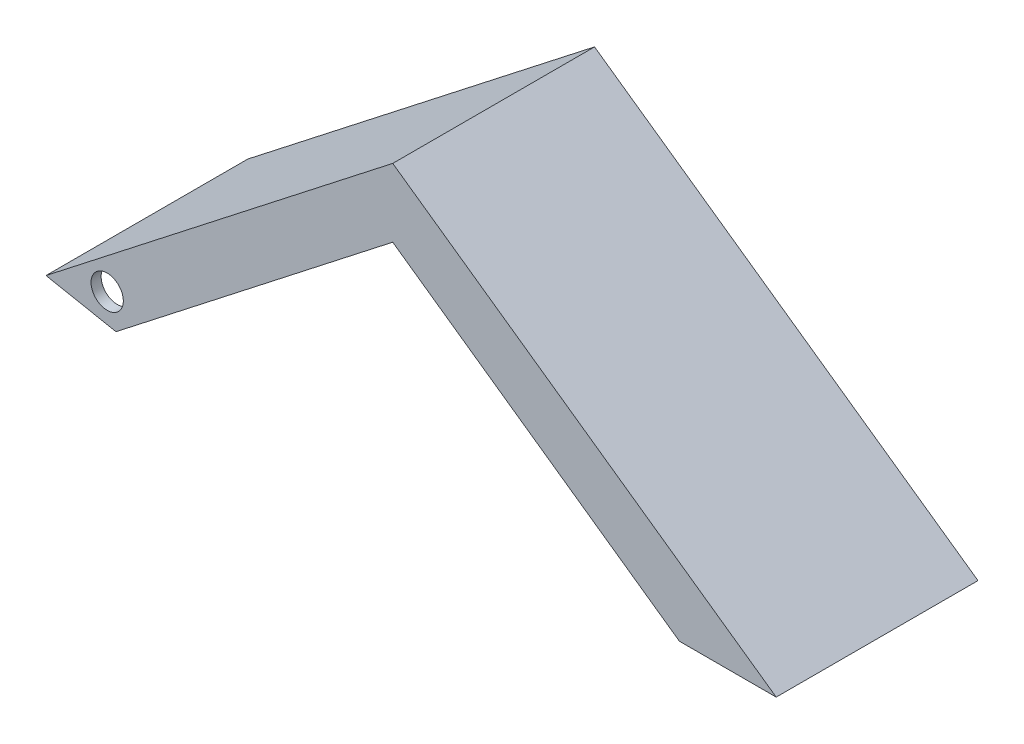
ISO-10303-21;
HEADER;
FILE_DESCRIPTION(('STEP AP214'),'2;1');
FILE_NAME('part.step','',(''),(''),'','','');
FILE_SCHEMA(('AUTOMOTIVE_DESIGN { 1 0 10303 214 1 1 1 1 }'));
ENDSEC;
DATA;
#1=APPLICATION_CONTEXT('core data for automotive mechanical design processes');
#2=APPLICATION_PROTOCOL_DEFINITION('international standard','automotive_design',2000,#1);
#3=PRODUCT_CONTEXT('',#1,'mechanical');
#4=PRODUCT('Part','Part','',(#3));
#5=PRODUCT_RELATED_PRODUCT_CATEGORY('part','',(#4));
#6=PRODUCT_DEFINITION_FORMATION('','',#4);
#7=PRODUCT_DEFINITION_CONTEXT('part definition',#1,'design');
#8=PRODUCT_DEFINITION('design','',#6,#7);
#9=PRODUCT_DEFINITION_SHAPE('','',#8);
#10=(LENGTH_UNIT() NAMED_UNIT(*) SI_UNIT(.MILLI.,.METRE.));
#11=(NAMED_UNIT(*) PLANE_ANGLE_UNIT() SI_UNIT($,.RADIAN.));
#12=(NAMED_UNIT(*) SI_UNIT($,.STERADIAN.) SOLID_ANGLE_UNIT());
#13=UNCERTAINTY_MEASURE_WITH_UNIT(LENGTH_MEASURE(1.E-05),#10,'distance_accuracy_value','');
#14=(GEOMETRIC_REPRESENTATION_CONTEXT(3) GLOBAL_UNCERTAINTY_ASSIGNED_CONTEXT((#13)) GLOBAL_UNIT_ASSIGNED_CONTEXT((#10,
#11,#12)) REPRESENTATION_CONTEXT('',''));
#15=CARTESIAN_POINT('',(0.,0.,0.));
#16=DIRECTION('',(0.,0.,1.));
#17=DIRECTION('',(1.,0.,0.));
#18=AXIS2_PLACEMENT_3D('',#15,#16,#17);
#19=CARTESIAN_POINT('',(3.46905594900029,-0.675941591937085,10.));
#20=DIRECTION('',(-0.191252132283475,-0.981540942547495,0.));
#21=DIRECTION('',(0.981540942547495,-0.191252132283475,0.));
#22=AXIS2_PLACEMENT_3D('',#19,#20,#21);
#23=PLANE('',#22);
#24=DIRECTION('',(-0.981540942547494,0.191252132283475,0.));
#25=VECTOR('',#24,1.);
#26=CARTESIAN_POINT('',(3.46905594900029,-0.675941591937085,0.));
#27=LINE('',#26,#25);
#28=CARTESIAN_POINT('',(3.46905594900029,-0.675941591937085,0.));
#29=VERTEX_POINT('',#28);
#30=CARTESIAN_POINT('',(0.,0.,0.));
#31=VERTEX_POINT('',#30);
#32=EDGE_CURVE('E208',#29,#31,#27,.T.);
#33=ORIENTED_EDGE('',*,*,#32,.F.);
#34=DIRECTION('',(0.,0.,-1.));
#35=VECTOR('',#34,1.);
#36=CARTESIAN_POINT('',(3.46905594900029,-0.675941591937085,10.));
#37=LINE('',#36,#35);
#38=CARTESIAN_POINT('',(3.46905594900029,-0.675941591937085,10.));
#39=VERTEX_POINT('',#38);
#40=EDGE_CURVE('E11',#39,#29,#37,.T.);
#41=ORIENTED_EDGE('',*,*,#40,.F.);
#42=DIRECTION('',(-0.981540942547494,0.191252132283475,0.));
#43=VECTOR('',#42,1.);
#44=CARTESIAN_POINT('',(3.46905594900029,-0.675941591937085,10.));
#45=LINE('',#44,#43);
#46=CARTESIAN_POINT('',(0.,0.,10.));
#47=VERTEX_POINT('',#46);
#48=EDGE_CURVE('E211',#39,#47,#45,.T.);
#49=ORIENTED_EDGE('',*,*,#48,.T.);
#50=DIRECTION('',(0.,0.,-1.));
#51=VECTOR('',#50,1.);
#52=CARTESIAN_POINT('',(0.,0.,10.));
#53=LINE('',#52,#51);
#54=EDGE_CURVE('E38',#47,#31,#53,.T.);
#55=ORIENTED_EDGE('',*,*,#54,.T.);
#56=EDGE_LOOP('',(#33,#41,#49,#55));
#57=FACE_BOUND('',#56,.T.);
#58=DIRECTION('',(0.,0.,-1.));
#59=VECTOR('',#58,1.);
#60=CARTESIAN_POINT('',(2.81861180438877,-0.549203292803696,10.));
#61=LINE('',#60,#59);
#62=CARTESIAN_POINT('',(2.81861180438878,-0.549203292803696,9.5));
#63=VERTEX_POINT('',#62);
#64=CARTESIAN_POINT('',(2.81861180438878,-0.549203292803696,0.5));
#65=VERTEX_POINT('',#64);
#66=EDGE_CURVE('E149',#63,#65,#61,.T.);
#67=ORIENTED_EDGE('',*,*,#66,.T.);
#68=DIRECTION('',(-0.981540942547495,0.191252132283475,0.));
#69=VECTOR('',#68,1.);
#70=CARTESIAN_POINT('',(0.,0.,0.5));
#71=LINE('',#70,#69);
#72=CARTESIAN_POINT('',(0.650444144611514,-0.126738299133389,0.5));
#73=VERTEX_POINT('',#72);
#74=EDGE_CURVE('E192',#65,#73,#71,.T.);
#75=ORIENTED_EDGE('',*,*,#74,.T.);
#76=DIRECTION('',(0.,0.,-1.));
#77=VECTOR('',#76,1.);
#78=CARTESIAN_POINT('',(0.650444144611513,-0.126738299133389,10.));
#79=LINE('',#78,#77);
#80=CARTESIAN_POINT('',(0.650444144611514,-0.126738299133389,9.5));
#81=VERTEX_POINT('',#80);
#82=EDGE_CURVE('E161',#81,#73,#79,.T.);
#83=ORIENTED_EDGE('',*,*,#82,.F.);
#84=DIRECTION('',(-0.981540942547495,0.191252132283475,0.));
#85=VECTOR('',#84,1.);
#86=CARTESIAN_POINT('',(0.,0.,9.5));
#87=LINE('',#86,#85);
#88=EDGE_CURVE('E51',#63,#81,#87,.T.);
#89=ORIENTED_EDGE('',*,*,#88,.F.);
#90=EDGE_LOOP('',(#67,#75,#83,#89));
#91=FACE_BOUND('',#90,.T.);
#92=ADVANCED_FACE('F35',(#57,#91),#23,.T.);
#93=CARTESIAN_POINT('',(17.1816413595403,10.0210275837205,10.));
#94=DIRECTION('',(0.61507300131341,-0.788470166243031,0.));
#95=DIRECTION('',(0.788470166243031,0.61507300131341,0.));
#96=AXIS2_PLACEMENT_3D('',#93,#94,#95);
#97=PLANE('',#96);
#98=DIRECTION('',(-0.788470166243031,-0.61507300131341,0.));
#99=VECTOR('',#98,1.);
#100=CARTESIAN_POINT('',(17.1816413595403,10.0210275837205,0.));
#101=LINE('',#100,#99);
#102=CARTESIAN_POINT('',(17.1816413595403,10.0210275837205,0.));
#103=VERTEX_POINT('',#102);
#104=EDGE_CURVE('E215',#103,#29,#101,.T.);
#105=ORIENTED_EDGE('',*,*,#104,.F.);
#106=DIRECTION('',(0.,0.,-1.));
#107=VECTOR('',#106,1.);
#108=CARTESIAN_POINT('',(17.1816413595403,10.0210275837205,10.));
#109=LINE('',#108,#107);
#110=CARTESIAN_POINT('',(17.1816413595403,10.0210275837205,10.));
#111=VERTEX_POINT('',#110);
#112=EDGE_CURVE('E43',#111,#103,#109,.T.);
#113=ORIENTED_EDGE('',*,*,#112,.F.);
#114=DIRECTION('',(-0.788470166243031,-0.61507300131341,0.));
#115=VECTOR('',#114,1.);
#116=CARTESIAN_POINT('',(17.1816413595403,10.0210275837205,10.));
#117=LINE('',#116,#115);
#118=EDGE_CURVE('E227',#111,#39,#117,.T.);
#119=ORIENTED_EDGE('',*,*,#118,.T.);
#120=ORIENTED_EDGE('',*,*,#40,.T.);
#121=EDGE_LOOP('',(#105,#113,#119,#120));
#122=FACE_BOUND('',#121,.T.);
#123=ADVANCED_FACE('F265',(#122),#97,.T.);
#124=CARTESIAN_POINT('',(31.3880506521978,0.,10.));
#125=DIRECTION('',(-0.576413428208703,-0.817158221999076,0.));
#126=DIRECTION('',(0.817158221999076,-0.576413428208703,0.));
#127=AXIS2_PLACEMENT_3D('',#124,#125,#126);
#128=PLANE('',#127);
#129=DIRECTION('',(-0.817158221999076,0.576413428208703,0.));
#130=VECTOR('',#129,1.);
#131=CARTESIAN_POINT('',(31.3880506521978,0.,0.));
#132=LINE('',#131,#130);
#133=CARTESIAN_POINT('',(31.3880506521978,0.,0.));
#134=VERTEX_POINT('',#133);
#135=EDGE_CURVE('E241',#134,#103,#132,.T.);
#136=ORIENTED_EDGE('',*,*,#135,.F.);
#137=DIRECTION('',(0.,0.,-1.));
#138=VECTOR('',#137,1.);
#139=CARTESIAN_POINT('',(31.3880506521978,0.,10.));
#140=LINE('',#139,#138);
#141=CARTESIAN_POINT('',(31.3880506521978,0.,10.));
#142=VERTEX_POINT('',#141);
#143=EDGE_CURVE('E247',#142,#134,#140,.T.);
#144=ORIENTED_EDGE('',*,*,#143,.F.);
#145=DIRECTION('',(-0.817158221999076,0.576413428208703,0.));
#146=VECTOR('',#145,1.);
#147=CARTESIAN_POINT('',(31.3880506521978,0.,10.));
#148=LINE('',#147,#146);
#149=EDGE_CURVE('E224',#142,#111,#148,.T.);
#150=ORIENTED_EDGE('',*,*,#149,.T.);
#151=ORIENTED_EDGE('',*,*,#112,.T.);
#152=EDGE_LOOP('',(#136,#144,#150,#151));
#153=FACE_BOUND('',#152,.T.);
#154=ADVANCED_FACE('F278',(#153),#128,.T.);
#155=CARTESIAN_POINT('',(36.1827137884698,0.,10.));
#156=DIRECTION('',(0.,-1.,0.));
#157=DIRECTION('',(0.,0.,-1.));
#158=AXIS2_PLACEMENT_3D('',#155,#156,#157);
#159=PLANE('',#158);
#160=DIRECTION('',(-1.,0.,0.));
#161=VECTOR('',#160,1.);
#162=CARTESIAN_POINT('',(36.1827137884698,0.,0.));
#163=LINE('',#162,#161);
#164=CARTESIAN_POINT('',(36.1827137884698,0.,0.));
#165=VERTEX_POINT('',#164);
#166=EDGE_CURVE('E238',#165,#134,#163,.T.);
#167=ORIENTED_EDGE('',*,*,#166,.F.);
#168=DIRECTION('',(0.,0.,-1.));
#169=VECTOR('',#168,1.);
#170=CARTESIAN_POINT('',(36.1827137884698,0.,10.));
#171=LINE('',#170,#169);
#172=CARTESIAN_POINT('',(36.1827137884698,0.,10.));
#173=VERTEX_POINT('',#172);
#174=EDGE_CURVE('E249',#173,#165,#171,.T.);
#175=ORIENTED_EDGE('',*,*,#174,.F.);
#176=DIRECTION('',(-1.,0.,0.));
#177=VECTOR('',#176,1.);
#178=CARTESIAN_POINT('',(36.1827137884698,0.,10.));
#179=LINE('',#178,#177);
#180=EDGE_CURVE('E221',#173,#142,#179,.T.);
#181=ORIENTED_EDGE('',*,*,#180,.T.);
#182=ORIENTED_EDGE('',*,*,#143,.T.);
#183=EDGE_LOOP('',(#167,#175,#181,#182));
#184=FACE_BOUND('',#183,.T.);
#185=ADVANCED_FACE('F276',(#184),#159,.T.);
#186=CARTESIAN_POINT('',(17.1816413595403,13.4031243932261,10.));
#187=DIRECTION('',(0.576413428208703,0.817158221999076,0.));
#188=DIRECTION('',(-0.817158221999076,0.576413428208703,0.));
#189=AXIS2_PLACEMENT_3D('',#186,#187,#188);
#190=PLANE('',#189);
#191=DIRECTION('',(0.817158221999076,-0.576413428208703,0.));
#192=VECTOR('',#191,1.);
#193=CARTESIAN_POINT('',(17.1816413595403,13.4031243932261,0.));
#194=LINE('',#193,#192);
#195=CARTESIAN_POINT('',(17.1816413595403,13.4031243932261,0.));
#196=VERTEX_POINT('',#195);
#197=EDGE_CURVE('E235',#196,#165,#194,.T.);
#198=ORIENTED_EDGE('',*,*,#197,.F.);
#199=DIRECTION('',(0.,0.,-1.));
#200=VECTOR('',#199,1.);
#201=CARTESIAN_POINT('',(17.1816413595403,13.4031243932261,10.));
#202=LINE('',#201,#200);
#203=CARTESIAN_POINT('',(17.1816413595403,13.4031243932261,10.));
#204=VERTEX_POINT('',#203);
#205=EDGE_CURVE('E250',#204,#196,#202,.T.);
#206=ORIENTED_EDGE('',*,*,#205,.F.);
#207=DIRECTION('',(0.817158221999076,-0.576413428208703,0.));
#208=VECTOR('',#207,1.);
#209=CARTESIAN_POINT('',(17.1816413595403,13.4031243932261,10.));
#210=LINE('',#209,#208);
#211=EDGE_CURVE('E218',#204,#173,#210,.T.);
#212=ORIENTED_EDGE('',*,*,#211,.T.);
#213=ORIENTED_EDGE('',*,*,#174,.T.);
#214=EDGE_LOOP('',(#198,#206,#212,#213));
#215=FACE_BOUND('',#214,.T.);
#216=ADVANCED_FACE('F273',(#215),#190,.T.);
#217=CARTESIAN_POINT('',(0.,0.,10.));
#218=DIRECTION('',(-0.61507300131341,0.788470166243031,0.));
#219=DIRECTION('',(-0.788470166243031,-0.61507300131341,0.));
#220=AXIS2_PLACEMENT_3D('',#217,#218,#219);
#221=PLANE('',#220);
#222=DIRECTION('',(0.788470166243031,0.61507300131341,0.));
#223=VECTOR('',#222,1.);
#224=CARTESIAN_POINT('',(0.,0.,0.));
#225=LINE('',#224,#223);
#226=EDGE_CURVE('E232',#31,#196,#225,.T.);
#227=ORIENTED_EDGE('',*,*,#226,.F.);
#228=ORIENTED_EDGE('',*,*,#54,.F.);
#229=DIRECTION('',(0.788470166243031,0.61507300131341,0.));
#230=VECTOR('',#229,1.);
#231=CARTESIAN_POINT('',(0.,0.,10.));
#232=LINE('',#231,#230);
#233=EDGE_CURVE('E214',#47,#204,#232,.T.);
#234=ORIENTED_EDGE('',*,*,#233,.T.);
#235=ORIENTED_EDGE('',*,*,#205,.T.);
#236=EDGE_LOOP('',(#227,#228,#234,#235));
#237=FACE_BOUND('',#236,.T.);
#238=ADVANCED_FACE('F259',(#237),#221,.T.);
#239=CARTESIAN_POINT('',(0.,0.,10.));
#240=DIRECTION('',(0.,0.,-1.));
#241=DIRECTION('',(-1.,0.,0.));
#242=AXIS2_PLACEMENT_3D('',#239,#240,#241);
#243=PLANE('',#242);
#244=CARTESIAN_POINT('',(3.03145353007508,0.822261972882502,10.));
#245=DIRECTION('',(0.,0.,1.));
#246=DIRECTION('',(1.,0.,0.));
#247=AXIS2_PLACEMENT_3D('',#244,#245,#246);
#248=CIRCLE('',#247,0.8);
#249=CARTESIAN_POINT('',(3.83145353007508,0.822261972882502,10.));
#250=VERTEX_POINT('',#249);
#251=EDGE_CURVE('E204',#250,#250,#248,.T.);
#252=ORIENTED_EDGE('',*,*,#251,.F.);
#253=EDGE_LOOP('',(#252));
#254=FACE_BOUND('',#253,.T.);
#255=ORIENTED_EDGE('',*,*,#48,.F.);
#256=ORIENTED_EDGE('',*,*,#118,.F.);
#257=ORIENTED_EDGE('',*,*,#149,.F.);
#258=ORIENTED_EDGE('',*,*,#180,.F.);
#259=ORIENTED_EDGE('',*,*,#211,.F.);
#260=ORIENTED_EDGE('',*,*,#233,.F.);
#261=EDGE_LOOP('',(#255,#256,#257,#258,#259,#260));
#262=FACE_BOUND('',#261,.T.);
#263=ADVANCED_FACE('F268',(#254,#262),#243,.F.);
#264=CARTESIAN_POINT('',(0.,0.,0.));
#265=DIRECTION('',(0.,0.,-1.));
#266=DIRECTION('',(-1.,0.,0.));
#267=AXIS2_PLACEMENT_3D('',#264,#265,#266);
#268=PLANE('',#267);
#269=CARTESIAN_POINT('',(3.03145353007508,0.822261972882502,0.));
#270=DIRECTION('',(0.,0.,1.));
#271=DIRECTION('',(1.,0.,0.));
#272=AXIS2_PLACEMENT_3D('',#269,#270,#271);
#273=CIRCLE('',#272,0.8);
#274=CARTESIAN_POINT('',(3.83145353007508,0.822261972882502,0.));
#275=VERTEX_POINT('',#274);
#276=EDGE_CURVE('E205',#275,#275,#273,.T.);
#277=ORIENTED_EDGE('',*,*,#276,.T.);
#278=EDGE_LOOP('',(#277));
#279=FACE_BOUND('',#278,.T.);
#280=ORIENTED_EDGE('',*,*,#32,.T.);
#281=ORIENTED_EDGE('',*,*,#226,.T.);
#282=ORIENTED_EDGE('',*,*,#197,.T.);
#283=ORIENTED_EDGE('',*,*,#166,.T.);
#284=ORIENTED_EDGE('',*,*,#135,.T.);
#285=ORIENTED_EDGE('',*,*,#104,.T.);
#286=EDGE_LOOP('',(#280,#281,#282,#283,#284,#285));
#287=FACE_BOUND('',#286,.T.);
#288=ADVANCED_FACE('F261',(#279,#287),#268,.T.);
#289=CARTESIAN_POINT('',(3.03145353007508,0.822261972882502,0.));
#290=DIRECTION('',(0.,0.,1.));
#291=DIRECTION('',(1.,0.,0.));
#292=AXIS2_PLACEMENT_3D('',#289,#290,#291);
#293=CYLINDRICAL_SURFACE('',#292,0.8);
#294=CARTESIAN_POINT('',(3.03145353007508,0.822261972882502,9.5));
#295=DIRECTION('',(0.,0.,-1.));
#296=DIRECTION('',(-1.,0.,0.));
#297=AXIS2_PLACEMENT_3D('',#294,#295,#296);
#298=CIRCLE('',#297,0.8);
#299=CARTESIAN_POINT('',(2.30992207474839,1.16779396702219,9.5));
#300=VERTEX_POINT('',#299);
#301=CARTESIAN_POINT('',(2.87190990348045,1.60619170902792,9.5));
#302=VERTEX_POINT('',#301);
#303=EDGE_CURVE('E196',#300,#302,#298,.F.);
#304=ORIENTED_EDGE('',*,*,#303,.F.);
#305=DIRECTION('',(0.,0.,1.));
#306=VECTOR('',#305,1.);
#307=CARTESIAN_POINT('',(2.30992207474839,1.16779396702219,0.));
#308=LINE('',#307,#306);
#309=CARTESIAN_POINT('',(2.30992207474839,1.16779396702219,0.5));
#310=VERTEX_POINT('',#309);
#311=EDGE_CURVE('E201',#300,#310,#308,.F.);
#312=ORIENTED_EDGE('',*,*,#311,.T.);
#313=CARTESIAN_POINT('',(3.03145353007508,0.822261972882502,0.5));
#314=DIRECTION('',(0.,0.,-1.));
#315=DIRECTION('',(-1.,0.,0.));
#316=AXIS2_PLACEMENT_3D('',#313,#314,#315);
#317=CIRCLE('',#316,0.8);
#318=CARTESIAN_POINT('',(2.87190990348045,1.60619170902792,0.5));
#319=VERTEX_POINT('',#318);
#320=EDGE_CURVE('E195',#310,#319,#317,.F.);
#321=ORIENTED_EDGE('',*,*,#320,.T.);
#322=DIRECTION('',(0.,0.,1.));
#323=VECTOR('',#322,1.);
#324=CARTESIAN_POINT('',(2.87190990348045,1.60619170902792,0.));
#325=LINE('',#324,#323);
#326=EDGE_CURVE('E190',#302,#319,#325,.F.);
#327=ORIENTED_EDGE('',*,*,#326,.F.);
#328=EDGE_LOOP('',(#304,#312,#321,#327));
#329=FACE_BOUND('',#328,.T.);
#330=ORIENTED_EDGE('',*,*,#276,.F.);
#331=EDGE_LOOP('',(#330));
#332=FACE_BOUND('',#331,.T.);
#333=ORIENTED_EDGE('',*,*,#251,.T.);
#334=EDGE_LOOP('',(#333));
#335=FACE_BOUND('',#334,.T.);
#336=ADVANCED_FACE('F356',(#329,#332,#335),#293,.F.);
#337=CARTESIAN_POINT('',(0.307536500656705,-0.394235083121516,10.));
#338=DIRECTION('',(-0.61507300131341,0.788470166243031,0.));
#339=DIRECTION('',(-0.788470166243031,-0.61507300131341,0.));
#340=AXIS2_PLACEMENT_3D('',#337,#338,#339);
#341=PLANE('',#340);
#342=DIRECTION('',(0.788470166243031,0.61507300131341,0.));
#343=VECTOR('',#342,1.);
#344=CARTESIAN_POINT('',(0.307536500656705,-0.394235083121516,9.5));
#345=LINE('',#344,#343);
#346=EDGE_CURVE('E188',#81,#300,#345,.T.);
#347=ORIENTED_EDGE('',*,*,#346,.F.);
#348=ORIENTED_EDGE('',*,*,#82,.T.);
#349=DIRECTION('',(0.788470166243031,0.61507300131341,0.));
#350=VECTOR('',#349,1.);
#351=CARTESIAN_POINT('',(0.307536500656705,-0.394235083121516,0.5));
#352=LINE('',#351,#350);
#353=EDGE_CURVE('E180',#73,#310,#352,.T.);
#354=ORIENTED_EDGE('',*,*,#353,.T.);
#355=ORIENTED_EDGE('',*,*,#311,.F.);
#356=EDGE_LOOP('',(#347,#348,#354,#355));
#357=FACE_BOUND('',#356,.T.);
#358=ADVANCED_FACE('F308',(#357),#341,.F.);
#359=CARTESIAN_POINT('',(16.8741048588836,10.415262666842,10.));
#360=DIRECTION('',(0.61507300131341,-0.788470166243031,0.));
#361=DIRECTION('',(0.788470166243031,0.61507300131341,0.));
#362=AXIS2_PLACEMENT_3D('',#359,#360,#361);
#363=PLANE('',#362);
#364=DIRECTION('',(-0.788470166243031,-0.61507300131341,0.));
#365=VECTOR('',#364,1.);
#366=CARTESIAN_POINT('',(1.33266786735259,-1.70836445864874,0.5));
#367=LINE('',#366,#365);
#368=CARTESIAN_POINT('',(17.1666543398348,10.6434758510373,0.5));
#369=VERTEX_POINT('',#368);
#370=EDGE_CURVE('E168',#369,#65,#367,.T.);
#371=ORIENTED_EDGE('',*,*,#370,.T.);
#372=ORIENTED_EDGE('',*,*,#66,.F.);
#373=DIRECTION('',(-0.788470166243031,-0.61507300131341,0.));
#374=VECTOR('',#373,1.);
#375=CARTESIAN_POINT('',(1.33266786735259,-1.70836445864874,9.5));
#376=LINE('',#375,#374);
#377=CARTESIAN_POINT('',(17.1666543398348,10.6434758510373,9.5));
#378=VERTEX_POINT('',#377);
#379=EDGE_CURVE('E154',#378,#63,#376,.T.);
#380=ORIENTED_EDGE('',*,*,#379,.F.);
#381=DIRECTION('',(0.,0.,-1.));
#382=VECTOR('',#381,1.);
#383=CARTESIAN_POINT('',(17.1666543398348,10.6434758510373,10.));
#384=LINE('',#383,#382);
#385=EDGE_CURVE('E138',#378,#369,#384,.T.);
#386=ORIENTED_EDGE('',*,*,#385,.T.);
#387=EDGE_LOOP('',(#371,#372,#380,#386));
#388=FACE_BOUND('',#387,.T.);
#389=ADVANCED_FACE('F159',(#388),#363,.F.);
#390=CARTESIAN_POINT('',(31.6762573663022,0.408579110999538,10.));
#391=DIRECTION('',(-0.576413428208703,-0.817158221999076,0.));
#392=DIRECTION('',(0.817158221999076,-0.576413428208703,0.));
#393=AXIS2_PLACEMENT_3D('',#390,#391,#392);
#394=PLANE('',#393);
#395=DIRECTION('',(-0.817158221999076,0.576413428208703,0.));
#396=VECTOR('',#395,1.);
#397=CARTESIAN_POINT('',(10.7169631370244,15.1930092425079,0.5));
#398=LINE('',#397,#396);
#399=CARTESIAN_POINT('',(31.5466536349294,0.5,0.5));
#400=VERTEX_POINT('',#399);
#401=EDGE_CURVE('E144',#400,#369,#398,.T.);
#402=ORIENTED_EDGE('',*,*,#401,.T.);
#403=ORIENTED_EDGE('',*,*,#385,.F.);
#404=DIRECTION('',(-0.817158221999076,0.576413428208703,0.));
#405=VECTOR('',#404,1.);
#406=CARTESIAN_POINT('',(10.7169631370244,15.1930092425079,9.5));
#407=LINE('',#406,#405);
#408=CARTESIAN_POINT('',(31.5466536349294,0.5,9.5));
#409=VERTEX_POINT('',#408);
#410=EDGE_CURVE('E141',#409,#378,#407,.T.);
#411=ORIENTED_EDGE('',*,*,#410,.F.);
#412=DIRECTION('',(0.,0.,-1.));
#413=VECTOR('',#412,1.);
#414=CARTESIAN_POINT('',(31.5466536349294,0.5,10.));
#415=LINE('',#414,#413);
#416=EDGE_CURVE('E150',#409,#400,#415,.T.);
#417=ORIENTED_EDGE('',*,*,#416,.T.);
#418=EDGE_LOOP('',(#402,#403,#411,#417));
#419=FACE_BOUND('',#418,.T.);
#420=ADVANCED_FACE('F140',(#419),#394,.F.);
#421=CARTESIAN_POINT('',(36.1827137884698,0.5,10.));
#422=DIRECTION('',(0.,-1.,0.));
#423=DIRECTION('',(0.,0.,-1.));
#424=AXIS2_PLACEMENT_3D('',#421,#422,#423);
#425=PLANE('',#424);
#426=DIRECTION('',(-1.,0.,0.));
#427=VECTOR('',#426,1.);
#428=CARTESIAN_POINT('',(0.,0.5,0.5));
#429=LINE('',#428,#427);
#430=CARTESIAN_POINT('',(34.6064508727652,0.5,0.5));
#431=VERTEX_POINT('',#430);
#432=EDGE_CURVE('E169',#431,#400,#429,.T.);
#433=ORIENTED_EDGE('',*,*,#432,.T.);
#434=ORIENTED_EDGE('',*,*,#416,.F.);
#435=DIRECTION('',(-1.,0.,0.));
#436=VECTOR('',#435,1.);
#437=CARTESIAN_POINT('',(0.,0.5,9.5));
#438=LINE('',#437,#436);
#439=CARTESIAN_POINT('',(34.6064508727652,0.5,9.5));
#440=VERTEX_POINT('',#439);
#441=EDGE_CURVE('E157',#440,#409,#438,.T.);
#442=ORIENTED_EDGE('',*,*,#441,.F.);
#443=DIRECTION('',(0.,0.,-1.));
#444=VECTOR('',#443,1.);
#445=CARTESIAN_POINT('',(34.6064508727652,0.500000000000002,10.));
#446=LINE('',#445,#444);
#447=EDGE_CURVE('E170',#440,#431,#446,.T.);
#448=ORIENTED_EDGE('',*,*,#447,.T.);
#449=EDGE_LOOP('',(#433,#434,#442,#448));
#450=FACE_BOUND('',#449,.T.);
#451=ADVANCED_FACE('F319',(#450),#425,.F.);
#452=CARTESIAN_POINT('',(16.8934346454359,12.9945452822266,10.));
#453=DIRECTION('',(0.576413428208703,0.817158221999076,0.));
#454=DIRECTION('',(-0.817158221999076,0.576413428208703,0.));
#455=AXIS2_PLACEMENT_3D('',#452,#453,#454);
#456=PLANE('',#455);
#457=DIRECTION('',(0.817158221999076,-0.576413428208703,0.));
#458=VECTOR('',#457,1.);
#459=CARTESIAN_POINT('',(11.7335882358716,16.6342379119983,0.5));
#460=LINE('',#459,#458);
#461=CARTESIAN_POINT('',(17.1966283792457,12.7806761259093,0.5));
#462=VERTEX_POINT('',#461);
#463=EDGE_CURVE('E174',#462,#431,#460,.T.);
#464=ORIENTED_EDGE('',*,*,#463,.T.);
#465=ORIENTED_EDGE('',*,*,#447,.F.);
#466=DIRECTION('',(0.817158221999076,-0.576413428208703,0.));
#467=VECTOR('',#466,1.);
#468=CARTESIAN_POINT('',(11.7335882358716,16.6342379119983,9.5));
#469=LINE('',#468,#467);
#470=CARTESIAN_POINT('',(17.1966283792457,12.7806761259093,9.5));
#471=VERTEX_POINT('',#470);
#472=EDGE_CURVE('E177',#471,#440,#469,.T.);
#473=ORIENTED_EDGE('',*,*,#472,.F.);
#474=DIRECTION('',(0.,0.,-1.));
#475=VECTOR('',#474,1.);
#476=CARTESIAN_POINT('',(17.1966283792457,12.7806761259093,10.));
#477=LINE('',#476,#475);
#478=EDGE_CURVE('E163',#471,#462,#477,.T.);
#479=ORIENTED_EDGE('',*,*,#478,.T.);
#480=EDGE_LOOP('',(#464,#465,#473,#479));
#481=FACE_BOUND('',#480,.T.);
#482=ADVANCED_FACE('F331',(#481),#456,.F.);
#483=ORIENTED_EDGE('',*,*,#326,.T.);
#484=EDGE_CURVE('E59',#319,#462,#352,.T.);
#485=ORIENTED_EDGE('',*,*,#484,.T.);
#486=ORIENTED_EDGE('',*,*,#478,.F.);
#487=EDGE_CURVE('E184',#302,#471,#345,.T.);
#488=ORIENTED_EDGE('',*,*,#487,.F.);
#489=EDGE_LOOP('',(#483,#485,#486,#488));
#490=FACE_BOUND('',#489,.T.);
#491=ADVANCED_FACE('F326',(#490),#341,.F.);
#492=CARTESIAN_POINT('',(0.,0.,9.5));
#493=DIRECTION('',(0.,0.,-1.));
#494=DIRECTION('',(-1.,0.,0.));
#495=AXIS2_PLACEMENT_3D('',#492,#493,#494);
#496=PLANE('',#495);
#497=ORIENTED_EDGE('',*,*,#487,.T.);
#498=ORIENTED_EDGE('',*,*,#472,.T.);
#499=ORIENTED_EDGE('',*,*,#441,.T.);
#500=ORIENTED_EDGE('',*,*,#410,.T.);
#501=ORIENTED_EDGE('',*,*,#379,.T.);
#502=ORIENTED_EDGE('',*,*,#88,.T.);
#503=ORIENTED_EDGE('',*,*,#346,.T.);
#504=ORIENTED_EDGE('',*,*,#303,.T.);
#505=EDGE_LOOP('',(#497,#498,#499,#500,#501,#502,#503,#504));
#506=FACE_BOUND('',#505,.T.);
#507=ADVANCED_FACE('F153',(#506),#496,.T.);
#508=CARTESIAN_POINT('',(0.,0.,0.5));
#509=DIRECTION('',(0.,0.,-1.));
#510=DIRECTION('',(-1.,0.,0.));
#511=AXIS2_PLACEMENT_3D('',#508,#509,#510);
#512=PLANE('',#511);
#513=ORIENTED_EDGE('',*,*,#74,.F.);
#514=ORIENTED_EDGE('',*,*,#370,.F.);
#515=ORIENTED_EDGE('',*,*,#401,.F.);
#516=ORIENTED_EDGE('',*,*,#432,.F.);
#517=ORIENTED_EDGE('',*,*,#463,.F.);
#518=ORIENTED_EDGE('',*,*,#484,.F.);
#519=ORIENTED_EDGE('',*,*,#320,.F.);
#520=ORIENTED_EDGE('',*,*,#353,.F.);
#521=EDGE_LOOP('',(#513,#514,#515,#516,#517,#518,#519,#520));
#522=FACE_BOUND('',#521,.T.);
#523=ADVANCED_FACE('F343',(#522),#512,.F.);
#524=CLOSED_SHELL('',(#92,#123,#154,#185,#216,#238,#263,#288,#336,#358,#389,#420,#451,#482,#491,
#507,#523));
#525=MANIFOLD_SOLID_BREP('B2',#524);
#526=ADVANCED_BREP_SHAPE_REPRESENTATION('',(#18,#525),#14);
#527=SHAPE_DEFINITION_REPRESENTATION(#9,#526);
ENDSEC;
END-ISO-10303-21;
